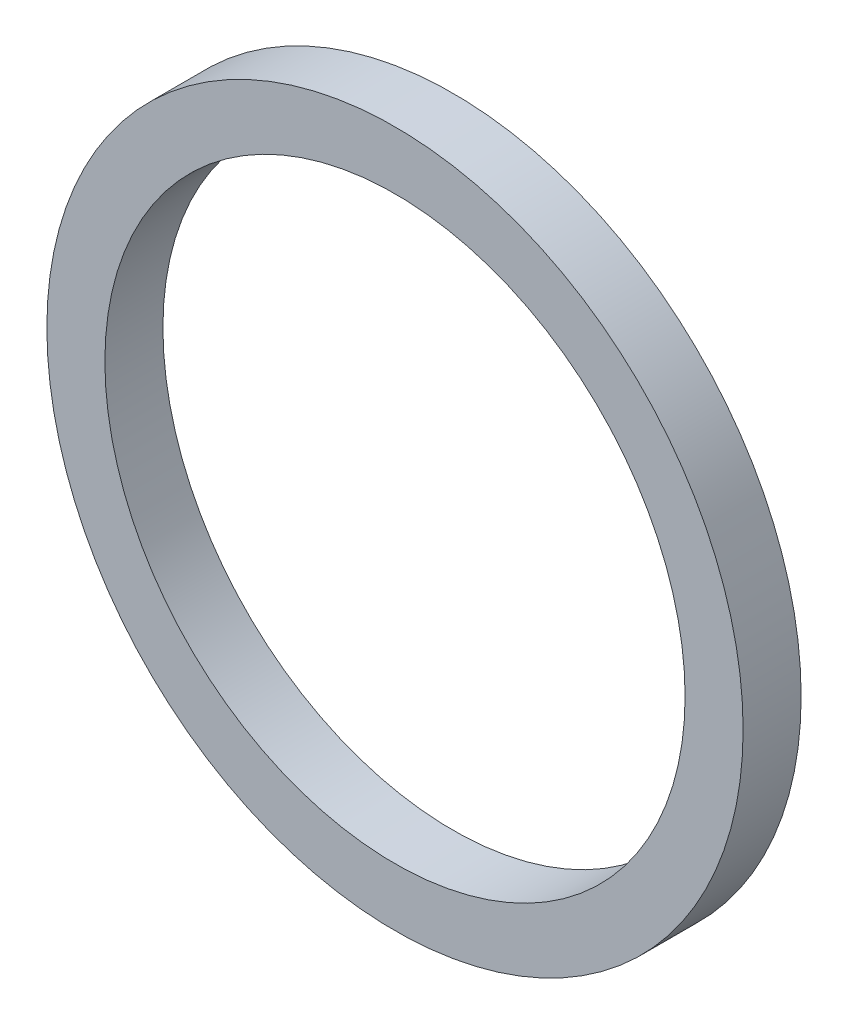
ISO-10303-21;
HEADER;
FILE_DESCRIPTION(('STEP AP214'),'2;1');
FILE_NAME('part.step','',(''),(''),'','','');
FILE_SCHEMA(('AUTOMOTIVE_DESIGN { 1 0 10303 214 1 1 1 1 }'));
ENDSEC;
DATA;
#1=APPLICATION_CONTEXT('core data for automotive mechanical design processes');
#2=APPLICATION_PROTOCOL_DEFINITION('international standard','automotive_design',2000,#1);
#3=PRODUCT_CONTEXT('',#1,'mechanical');
#4=PRODUCT('Part','Part','',(#3));
#5=PRODUCT_RELATED_PRODUCT_CATEGORY('part','',(#4));
#6=PRODUCT_DEFINITION_FORMATION('','',#4);
#7=PRODUCT_DEFINITION_CONTEXT('part definition',#1,'design');
#8=PRODUCT_DEFINITION('design','',#6,#7);
#9=PRODUCT_DEFINITION_SHAPE('','',#8);
#10=(LENGTH_UNIT() NAMED_UNIT(*) SI_UNIT(.MILLI.,.METRE.));
#11=(NAMED_UNIT(*) PLANE_ANGLE_UNIT() SI_UNIT($,.RADIAN.));
#12=(NAMED_UNIT(*) SI_UNIT($,.STERADIAN.) SOLID_ANGLE_UNIT());
#13=UNCERTAINTY_MEASURE_WITH_UNIT(LENGTH_MEASURE(1.E-05),#10,'distance_accuracy_value','');
#14=(GEOMETRIC_REPRESENTATION_CONTEXT(3) GLOBAL_UNCERTAINTY_ASSIGNED_CONTEXT((#13)) GLOBAL_UNIT_ASSIGNED_CONTEXT((#10,
#11,#12)) REPRESENTATION_CONTEXT('',''));
#15=CARTESIAN_POINT('',(0.,0.,0.));
#16=DIRECTION('',(0.,0.,1.));
#17=DIRECTION('',(1.,0.,0.));
#18=AXIS2_PLACEMENT_3D('',#15,#16,#17);
#19=CARTESIAN_POINT('',(0.,0.,1.));
#20=DIRECTION('',(0.,0.,1.));
#21=DIRECTION('',(1.,0.,0.));
#22=AXIS2_PLACEMENT_3D('',#19,#20,#21);
#23=PLANE('',#22);
#24=CARTESIAN_POINT('',(0.,0.,1.));
#25=DIRECTION('',(0.,0.,1.));
#26=DIRECTION('',(1.,0.,0.));
#27=AXIS2_PLACEMENT_3D('',#24,#25,#26);
#28=CIRCLE('',#27,6.);
#29=CARTESIAN_POINT('',(6.,0.,1.));
#30=VERTEX_POINT('',#29);
#31=EDGE_CURVE('E10',#30,#30,#28,.T.);
#32=ORIENTED_EDGE('',*,*,#31,.T.);
#33=EDGE_LOOP('',(#32));
#34=FACE_BOUND('',#33,.T.);
#35=CARTESIAN_POINT('',(0.,0.,1.));
#36=DIRECTION('',(0.,0.,1.));
#37=DIRECTION('',(1.,0.,0.));
#38=AXIS2_PLACEMENT_3D('',#35,#36,#37);
#39=CIRCLE('',#38,5.);
#40=CARTESIAN_POINT('',(5.,0.,1.));
#41=VERTEX_POINT('',#40);
#42=EDGE_CURVE('E48',#41,#41,#39,.T.);
#43=ORIENTED_EDGE('',*,*,#42,.F.);
#44=EDGE_LOOP('',(#43));
#45=FACE_BOUND('',#44,.T.);
#46=ADVANCED_FACE('F37',(#34,#45),#23,.T.);
#47=CARTESIAN_POINT('',(0.,0.,0.));
#48=DIRECTION('',(0.,0.,1.));
#49=DIRECTION('',(1.,0.,0.));
#50=AXIS2_PLACEMENT_3D('',#47,#48,#49);
#51=PLANE('',#50);
#52=CARTESIAN_POINT('',(0.,0.,0.));
#53=DIRECTION('',(0.,0.,1.));
#54=DIRECTION('',(1.,0.,0.));
#55=AXIS2_PLACEMENT_3D('',#52,#53,#54);
#56=CIRCLE('',#55,6.);
#57=CARTESIAN_POINT('',(6.,0.,0.));
#58=VERTEX_POINT('',#57);
#59=EDGE_CURVE('E41',#58,#58,#56,.T.);
#60=ORIENTED_EDGE('',*,*,#59,.F.);
#61=EDGE_LOOP('',(#60));
#62=FACE_BOUND('',#61,.T.);
#63=CARTESIAN_POINT('',(0.,0.,0.));
#64=DIRECTION('',(0.,0.,1.));
#65=DIRECTION('',(1.,0.,0.));
#66=AXIS2_PLACEMENT_3D('',#63,#64,#65);
#67=CIRCLE('',#66,5.);
#68=CARTESIAN_POINT('',(5.,0.,0.));
#69=VERTEX_POINT('',#68);
#70=EDGE_CURVE('E50',#69,#69,#67,.T.);
#71=ORIENTED_EDGE('',*,*,#70,.T.);
#72=EDGE_LOOP('',(#71));
#73=FACE_BOUND('',#72,.T.);
#74=ADVANCED_FACE('F60',(#62,#73),#51,.F.);
#75=CARTESIAN_POINT('',(0.,0.,1.));
#76=DIRECTION('',(0.,0.,-1.));
#77=DIRECTION('',(-1.,0.,0.));
#78=AXIS2_PLACEMENT_3D('',#75,#76,#77);
#79=CYLINDRICAL_SURFACE('',#78,6.);
#80=ORIENTED_EDGE('',*,*,#31,.F.);
#81=EDGE_LOOP('',(#80));
#82=FACE_BOUND('',#81,.T.);
#83=ORIENTED_EDGE('',*,*,#59,.T.);
#84=EDGE_LOOP('',(#83));
#85=FACE_BOUND('',#84,.T.);
#86=ADVANCED_FACE('F39',(#82,#85),#79,.T.);
#87=CARTESIAN_POINT('',(0.,0.,1.));
#88=DIRECTION('',(0.,0.,-1.));
#89=DIRECTION('',(-1.,0.,0.));
#90=AXIS2_PLACEMENT_3D('',#87,#88,#89);
#91=CYLINDRICAL_SURFACE('',#90,5.);
#92=ORIENTED_EDGE('',*,*,#42,.T.);
#93=EDGE_LOOP('',(#92));
#94=FACE_BOUND('',#93,.T.);
#95=ORIENTED_EDGE('',*,*,#70,.F.);
#96=EDGE_LOOP('',(#95));
#97=FACE_BOUND('',#96,.T.);
#98=ADVANCED_FACE('F56',(#94,#97),#91,.F.);
#99=CLOSED_SHELL('',(#46,#74,#86,#98));
#100=MANIFOLD_SOLID_BREP('B2',#99);
#101=ADVANCED_BREP_SHAPE_REPRESENTATION('',(#18,#100),#14);
#102=SHAPE_DEFINITION_REPRESENTATION(#9,#101);
ENDSEC;
END-ISO-10303-21;
